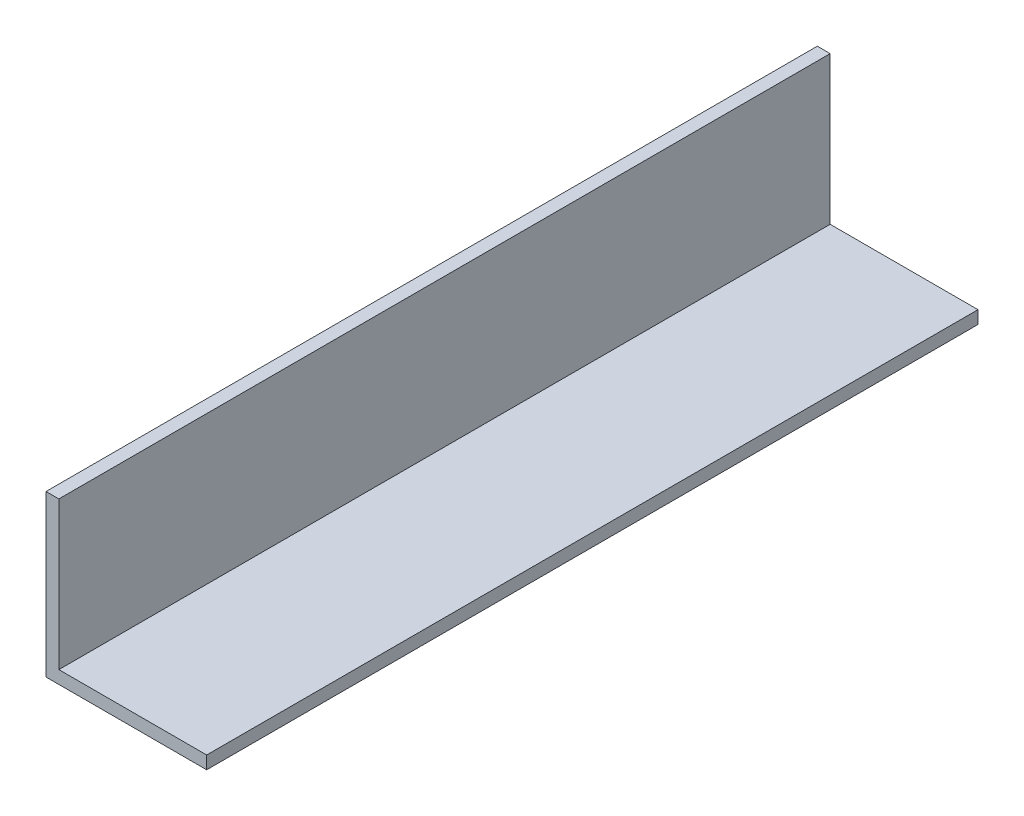
ISO-10303-21;
HEADER;
FILE_DESCRIPTION(('STEP AP214'),'2;1');
FILE_NAME('part.step','',(''),(''),'','','');
FILE_SCHEMA(('AUTOMOTIVE_DESIGN { 1 0 10303 214 1 1 1 1 }'));
ENDSEC;
DATA;
#1=APPLICATION_CONTEXT('core data for automotive mechanical design processes');
#2=APPLICATION_PROTOCOL_DEFINITION('international standard','automotive_design',2000,#1);
#3=PRODUCT_CONTEXT('',#1,'mechanical');
#4=PRODUCT('Part','Part','',(#3));
#5=PRODUCT_RELATED_PRODUCT_CATEGORY('part','',(#4));
#6=PRODUCT_DEFINITION_FORMATION('','',#4);
#7=PRODUCT_DEFINITION_CONTEXT('part definition',#1,'design');
#8=PRODUCT_DEFINITION('design','',#6,#7);
#9=PRODUCT_DEFINITION_SHAPE('','',#8);
#10=(LENGTH_UNIT() NAMED_UNIT(*) SI_UNIT(.MILLI.,.METRE.));
#11=(NAMED_UNIT(*) PLANE_ANGLE_UNIT() SI_UNIT($,.RADIAN.));
#12=(NAMED_UNIT(*) SI_UNIT($,.STERADIAN.) SOLID_ANGLE_UNIT());
#13=UNCERTAINTY_MEASURE_WITH_UNIT(LENGTH_MEASURE(1.E-05),#10,'distance_accuracy_value','');
#14=(GEOMETRIC_REPRESENTATION_CONTEXT(3) GLOBAL_UNCERTAINTY_ASSIGNED_CONTEXT((#13)) GLOBAL_UNIT_ASSIGNED_CONTEXT((#10,
#11,#12)) REPRESENTATION_CONTEXT('',''));
#15=CARTESIAN_POINT('',(0.,0.,0.));
#16=DIRECTION('',(0.,0.,1.));
#17=DIRECTION('',(1.,0.,0.));
#18=AXIS2_PLACEMENT_3D('',#15,#16,#17);
#19=CARTESIAN_POINT('',(0.,25.,120.));
#20=DIRECTION('',(1.,0.,0.));
#21=DIRECTION('',(0.,0.,-1.));
#22=AXIS2_PLACEMENT_3D('',#19,#20,#21);
#23=PLANE('',#22);
#24=DIRECTION('',(0.,-1.,0.));
#25=VECTOR('',#24,1.);
#26=CARTESIAN_POINT('',(0.,25.,0.));
#27=LINE('',#26,#25);
#28=CARTESIAN_POINT('',(0.,25.,0.));
#29=VERTEX_POINT('',#28);
#30=CARTESIAN_POINT('',(0.,0.,0.));
#31=VERTEX_POINT('',#30);
#32=EDGE_CURVE('E128',#29,#31,#27,.T.);
#33=ORIENTED_EDGE('',*,*,#32,.T.);
#34=DIRECTION('',(0.,0.,-1.));
#35=VECTOR('',#34,1.);
#36=CARTESIAN_POINT('',(0.,0.,120.));
#37=LINE('',#36,#35);
#38=CARTESIAN_POINT('',(0.,0.,120.));
#39=VERTEX_POINT('',#38);
#40=EDGE_CURVE('E11',#39,#31,#37,.T.);
#41=ORIENTED_EDGE('',*,*,#40,.F.);
#42=DIRECTION('',(0.,-1.,0.));
#43=VECTOR('',#42,1.);
#44=CARTESIAN_POINT('',(0.,25.,120.));
#45=LINE('',#44,#43);
#46=CARTESIAN_POINT('',(0.,25.,120.));
#47=VERTEX_POINT('',#46);
#48=EDGE_CURVE('E144',#47,#39,#45,.T.);
#49=ORIENTED_EDGE('',*,*,#48,.F.);
#50=DIRECTION('',(0.,0.,-1.));
#51=VECTOR('',#50,1.);
#52=CARTESIAN_POINT('',(0.,25.,120.));
#53=LINE('',#52,#51);
#54=EDGE_CURVE('E124',#47,#29,#53,.T.);
#55=ORIENTED_EDGE('',*,*,#54,.T.);
#56=EDGE_LOOP('',(#33,#41,#49,#55));
#57=FACE_BOUND('',#56,.T.);
#58=ADVANCED_FACE('F39',(#57),#23,.F.);
#59=CARTESIAN_POINT('',(0.,0.,120.));
#60=DIRECTION('',(0.,1.,0.));
#61=DIRECTION('',(0.,0.,1.));
#62=AXIS2_PLACEMENT_3D('',#59,#60,#61);
#63=PLANE('',#62);
#64=DIRECTION('',(1.,0.,0.));
#65=VECTOR('',#64,1.);
#66=CARTESIAN_POINT('',(0.,0.,0.));
#67=LINE('',#66,#65);
#68=CARTESIAN_POINT('',(25.,0.,0.));
#69=VERTEX_POINT('',#68);
#70=EDGE_CURVE('E132',#31,#69,#67,.T.);
#71=ORIENTED_EDGE('',*,*,#70,.T.);
#72=DIRECTION('',(0.,0.,-1.));
#73=VECTOR('',#72,1.);
#74=CARTESIAN_POINT('',(25.,0.,120.));
#75=LINE('',#74,#73);
#76=CARTESIAN_POINT('',(25.,0.,120.));
#77=VERTEX_POINT('',#76);
#78=EDGE_CURVE('E48',#77,#69,#75,.T.);
#79=ORIENTED_EDGE('',*,*,#78,.F.);
#80=DIRECTION('',(1.,0.,0.));
#81=VECTOR('',#80,1.);
#82=CARTESIAN_POINT('',(0.,0.,120.));
#83=LINE('',#82,#81);
#84=EDGE_CURVE('E93',#39,#77,#83,.T.);
#85=ORIENTED_EDGE('',*,*,#84,.F.);
#86=ORIENTED_EDGE('',*,*,#40,.T.);
#87=EDGE_LOOP('',(#71,#79,#85,#86));
#88=FACE_BOUND('',#87,.T.);
#89=ADVANCED_FACE('F172',(#88),#63,.F.);
#90=CARTESIAN_POINT('',(25.,0.,120.));
#91=DIRECTION('',(-1.,0.,0.));
#92=DIRECTION('',(0.,0.,1.));
#93=AXIS2_PLACEMENT_3D('',#90,#91,#92);
#94=PLANE('',#93);
#95=DIRECTION('',(0.,1.,0.));
#96=VECTOR('',#95,1.);
#97=CARTESIAN_POINT('',(25.,0.,0.));
#98=LINE('',#97,#96);
#99=CARTESIAN_POINT('',(25.,2.,0.));
#100=VERTEX_POINT('',#99);
#101=EDGE_CURVE('E135',#69,#100,#98,.T.);
#102=ORIENTED_EDGE('',*,*,#101,.T.);
#103=DIRECTION('',(0.,0.,-1.));
#104=VECTOR('',#103,1.);
#105=CARTESIAN_POINT('',(25.,2.,120.));
#106=LINE('',#105,#104);
#107=CARTESIAN_POINT('',(25.,2.,120.));
#108=VERTEX_POINT('',#107);
#109=EDGE_CURVE('E117',#108,#100,#106,.T.);
#110=ORIENTED_EDGE('',*,*,#109,.F.);
#111=DIRECTION('',(0.,1.,0.));
#112=VECTOR('',#111,1.);
#113=CARTESIAN_POINT('',(25.,0.,120.));
#114=LINE('',#113,#112);
#115=EDGE_CURVE('E106',#77,#108,#114,.T.);
#116=ORIENTED_EDGE('',*,*,#115,.F.);
#117=ORIENTED_EDGE('',*,*,#78,.T.);
#118=EDGE_LOOP('',(#102,#110,#116,#117));
#119=FACE_BOUND('',#118,.T.);
#120=ADVANCED_FACE('F154',(#119),#94,.F.);
#121=CARTESIAN_POINT('',(25.,2.,120.));
#122=DIRECTION('',(0.,-1.,0.));
#123=DIRECTION('',(1.,0.,0.));
#124=AXIS2_PLACEMENT_3D('',#121,#122,#123);
#125=PLANE('',#124);
#126=DIRECTION('',(-1.,0.,0.));
#127=VECTOR('',#126,1.);
#128=CARTESIAN_POINT('',(25.,2.,0.));
#129=LINE('',#128,#127);
#130=CARTESIAN_POINT('',(2.,2.,0.));
#131=VERTEX_POINT('',#130);
#132=EDGE_CURVE('E115',#100,#131,#129,.T.);
#133=ORIENTED_EDGE('',*,*,#132,.T.);
#134=DIRECTION('',(0.,0.,-1.));
#135=VECTOR('',#134,1.);
#136=CARTESIAN_POINT('',(2.,2.,120.));
#137=LINE('',#136,#135);
#138=CARTESIAN_POINT('',(2.,2.,120.));
#139=VERTEX_POINT('',#138);
#140=EDGE_CURVE('E112',#139,#131,#137,.T.);
#141=ORIENTED_EDGE('',*,*,#140,.F.);
#142=DIRECTION('',(-1.,0.,0.));
#143=VECTOR('',#142,1.);
#144=CARTESIAN_POINT('',(25.,2.,120.));
#145=LINE('',#144,#143);
#146=EDGE_CURVE('E100',#108,#139,#145,.T.);
#147=ORIENTED_EDGE('',*,*,#146,.F.);
#148=ORIENTED_EDGE('',*,*,#109,.T.);
#149=EDGE_LOOP('',(#133,#141,#147,#148));
#150=FACE_BOUND('',#149,.T.);
#151=ADVANCED_FACE('F113',(#150),#125,.F.);
#152=CARTESIAN_POINT('',(2.,2.,120.));
#153=DIRECTION('',(-1.,0.,0.));
#154=DIRECTION('',(0.,-1.,0.));
#155=AXIS2_PLACEMENT_3D('',#152,#153,#154);
#156=PLANE('',#155);
#157=DIRECTION('',(0.,1.,0.));
#158=VECTOR('',#157,1.);
#159=CARTESIAN_POINT('',(2.,2.,0.));
#160=LINE('',#159,#158);
#161=CARTESIAN_POINT('',(2.,25.,0.));
#162=VERTEX_POINT('',#161);
#163=EDGE_CURVE('E79',#131,#162,#160,.T.);
#164=ORIENTED_EDGE('',*,*,#163,.T.);
#165=DIRECTION('',(0.,0.,-1.));
#166=VECTOR('',#165,1.);
#167=CARTESIAN_POINT('',(2.,25.,120.));
#168=LINE('',#167,#166);
#169=CARTESIAN_POINT('',(2.,25.,120.));
#170=VERTEX_POINT('',#169);
#171=EDGE_CURVE('E118',#170,#162,#168,.T.);
#172=ORIENTED_EDGE('',*,*,#171,.F.);
#173=DIRECTION('',(0.,1.,0.));
#174=VECTOR('',#173,1.);
#175=CARTESIAN_POINT('',(2.,2.,120.));
#176=LINE('',#175,#174);
#177=EDGE_CURVE('E104',#139,#170,#176,.T.);
#178=ORIENTED_EDGE('',*,*,#177,.F.);
#179=ORIENTED_EDGE('',*,*,#140,.T.);
#180=EDGE_LOOP('',(#164,#172,#178,#179));
#181=FACE_BOUND('',#180,.T.);
#182=ADVANCED_FACE('F120',(#181),#156,.F.);
#183=CARTESIAN_POINT('',(2.,25.,120.));
#184=DIRECTION('',(0.,-1.,0.));
#185=DIRECTION('',(0.,0.,-1.));
#186=AXIS2_PLACEMENT_3D('',#183,#184,#185);
#187=PLANE('',#186);
#188=DIRECTION('',(-1.,0.,0.));
#189=VECTOR('',#188,1.);
#190=CARTESIAN_POINT('',(2.,25.,0.));
#191=LINE('',#190,#189);
#192=EDGE_CURVE('E85',#162,#29,#191,.T.);
#193=ORIENTED_EDGE('',*,*,#192,.T.);
#194=ORIENTED_EDGE('',*,*,#54,.F.);
#195=DIRECTION('',(-1.,0.,0.));
#196=VECTOR('',#195,1.);
#197=CARTESIAN_POINT('',(2.,25.,120.));
#198=LINE('',#197,#196);
#199=EDGE_CURVE('E56',#170,#47,#198,.T.);
#200=ORIENTED_EDGE('',*,*,#199,.F.);
#201=ORIENTED_EDGE('',*,*,#171,.T.);
#202=EDGE_LOOP('',(#193,#194,#200,#201));
#203=FACE_BOUND('',#202,.T.);
#204=ADVANCED_FACE('F161',(#203),#187,.F.);
#205=CARTESIAN_POINT('',(0.,0.,120.));
#206=DIRECTION('',(0.,0.,1.));
#207=DIRECTION('',(1.,0.,0.));
#208=AXIS2_PLACEMENT_3D('',#205,#206,#207);
#209=PLANE('',#208);
#210=ORIENTED_EDGE('',*,*,#48,.T.);
#211=ORIENTED_EDGE('',*,*,#84,.T.);
#212=ORIENTED_EDGE('',*,*,#115,.T.);
#213=ORIENTED_EDGE('',*,*,#146,.T.);
#214=ORIENTED_EDGE('',*,*,#177,.T.);
#215=ORIENTED_EDGE('',*,*,#199,.T.);
#216=EDGE_LOOP('',(#210,#211,#212,#213,#214,#215));
#217=FACE_BOUND('',#216,.T.);
#218=ADVANCED_FACE('F102',(#217),#209,.T.);
#219=CARTESIAN_POINT('',(0.,0.,0.));
#220=DIRECTION('',(0.,0.,1.));
#221=DIRECTION('',(1.,0.,0.));
#222=AXIS2_PLACEMENT_3D('',#219,#220,#221);
#223=PLANE('',#222);
#224=ORIENTED_EDGE('',*,*,#32,.F.);
#225=ORIENTED_EDGE('',*,*,#192,.F.);
#226=ORIENTED_EDGE('',*,*,#163,.F.);
#227=ORIENTED_EDGE('',*,*,#132,.F.);
#228=ORIENTED_EDGE('',*,*,#101,.F.);
#229=ORIENTED_EDGE('',*,*,#70,.F.);
#230=EDGE_LOOP('',(#224,#225,#226,#227,#228,#229));
#231=FACE_BOUND('',#230,.T.);
#232=ADVANCED_FACE('F157',(#231),#223,.F.);
#233=CLOSED_SHELL('',(#58,#89,#120,#151,#182,#204,#218,#232));
#234=MANIFOLD_SOLID_BREP('B2',#233);
#235=ADVANCED_BREP_SHAPE_REPRESENTATION('',(#18,#234),#14);
#236=SHAPE_DEFINITION_REPRESENTATION(#9,#235);
ENDSEC;
END-ISO-10303-21;
